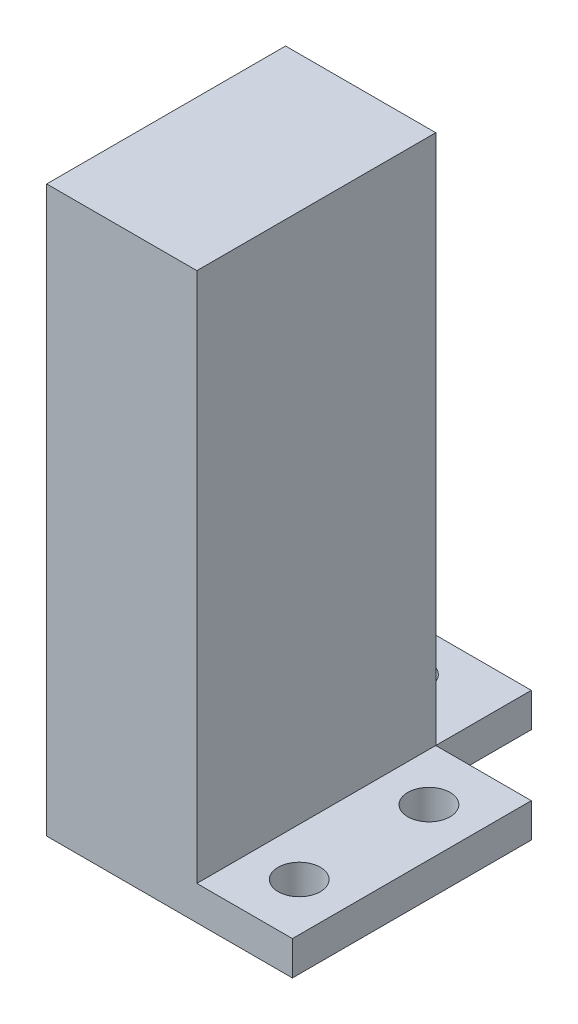
ISO-10303-21;
HEADER;
FILE_DESCRIPTION(('STEP AP214'),'2;1');
FILE_NAME('part.step','',(''),(''),'','','');
FILE_SCHEMA(('AUTOMOTIVE_DESIGN { 1 0 10303 214 1 1 1 1 }'));
ENDSEC;
DATA;
#1=APPLICATION_CONTEXT('core data for automotive mechanical design processes');
#2=APPLICATION_PROTOCOL_DEFINITION('international standard','automotive_design',2000,#1);
#3=PRODUCT_CONTEXT('',#1,'mechanical');
#4=PRODUCT('Part','Part','',(#3));
#5=PRODUCT_RELATED_PRODUCT_CATEGORY('part','',(#4));
#6=PRODUCT_DEFINITION_FORMATION('','',#4);
#7=PRODUCT_DEFINITION_CONTEXT('part definition',#1,'design');
#8=PRODUCT_DEFINITION('design','',#6,#7);
#9=PRODUCT_DEFINITION_SHAPE('','',#8);
#10=(LENGTH_UNIT() NAMED_UNIT(*) SI_UNIT(.MILLI.,.METRE.));
#11=(NAMED_UNIT(*) PLANE_ANGLE_UNIT() SI_UNIT($,.RADIAN.));
#12=(NAMED_UNIT(*) SI_UNIT($,.STERADIAN.) SOLID_ANGLE_UNIT());
#13=UNCERTAINTY_MEASURE_WITH_UNIT(LENGTH_MEASURE(1.E-05),#10,'distance_accuracy_value','');
#14=(GEOMETRIC_REPRESENTATION_CONTEXT(3) GLOBAL_UNCERTAINTY_ASSIGNED_CONTEXT((#13)) GLOBAL_UNIT_ASSIGNED_CONTEXT((#10,
#11,#12)) REPRESENTATION_CONTEXT('',''));
#15=CARTESIAN_POINT('',(0.,0.,0.));
#16=DIRECTION('',(0.,0.,1.));
#17=DIRECTION('',(1.,0.,0.));
#18=AXIS2_PLACEMENT_3D('',#15,#16,#17);
#19=CARTESIAN_POINT('',(11.,49.2196543089587,30.));
#20=DIRECTION('',(-1.,0.,0.));
#21=DIRECTION('',(0.,0.,1.));
#22=AXIS2_PLACEMENT_3D('',#19,#20,#21);
#23=PLANE('',#22);
#24=DIRECTION('',(0.,0.,1.));
#25=VECTOR('',#24,1.);
#26=CARTESIAN_POINT('',(11.,-28.5303456910413,0.));
#27=LINE('',#26,#25);
#28=CARTESIAN_POINT('',(11.,-28.5303456910413,0.));
#29=VERTEX_POINT('',#28);
#30=CARTESIAN_POINT('',(11.,-28.5303456910413,35.));
#31=VERTEX_POINT('',#30);
#32=EDGE_CURVE('E162',#29,#31,#27,.T.);
#33=ORIENTED_EDGE('',*,*,#32,.F.);
#34=DIRECTION('',(0.,1.,0.));
#35=VECTOR('',#34,1.);
#36=CARTESIAN_POINT('',(11.,49.2196543089587,0.));
#37=LINE('',#36,#35);
#38=CARTESIAN_POINT('',(11.,49.2196543089587,0.));
#39=VERTEX_POINT('',#38);
#40=EDGE_CURVE('E232',#29,#39,#37,.T.);
#41=ORIENTED_EDGE('',*,*,#40,.T.);
#42=DIRECTION('',(0.,0.,-1.));
#43=VECTOR('',#42,1.);
#44=CARTESIAN_POINT('',(11.,49.2196543089587,30.));
#45=LINE('',#44,#43);
#46=CARTESIAN_POINT('',(11.,49.2196543089587,35.));
#47=VERTEX_POINT('',#46);
#48=EDGE_CURVE('E235',#47,#39,#45,.T.);
#49=ORIENTED_EDGE('',*,*,#48,.F.);
#50=DIRECTION('',(0.,1.,0.));
#51=VECTOR('',#50,1.);
#52=CARTESIAN_POINT('',(11.,-33.5303456910413,35.));
#53=LINE('',#52,#51);
#54=EDGE_CURVE('E127',#31,#47,#53,.T.);
#55=ORIENTED_EDGE('',*,*,#54,.F.);
#56=EDGE_LOOP('',(#33,#41,#49,#55));
#57=FACE_BOUND('',#56,.T.);
#58=ADVANCED_FACE('F45',(#57),#23,.F.);
#59=CARTESIAN_POINT('',(0.,0.,0.));
#60=DIRECTION('',(0.,0.,1.));
#61=DIRECTION('',(1.,0.,0.));
#62=AXIS2_PLACEMENT_3D('',#59,#60,#61);
#63=PLANE('',#62);
#64=CARTESIAN_POINT('',(0.,7.71965430895869,0.));
#65=DIRECTION('',(0.,0.,1.));
#66=DIRECTION('',(1.,0.,0.));
#67=AXIS2_PLACEMENT_3D('',#64,#65,#66);
#68=CIRCLE('',#67,3.1);
#69=CARTESIAN_POINT('',(3.09999999999998,7.71965430895869,0.));
#70=VERTEX_POINT('',#69);
#71=EDGE_CURVE('E217',#70,#70,#68,.T.);
#72=ORIENTED_EDGE('',*,*,#71,.T.);
#73=EDGE_LOOP('',(#72));
#74=FACE_BOUND('',#73,.T.);
#75=CARTESIAN_POINT('',(0.,35.7196543089587,0.));
#76=DIRECTION('',(0.,0.,1.));
#77=DIRECTION('',(1.,0.,0.));
#78=AXIS2_PLACEMENT_3D('',#75,#76,#77);
#79=CIRCLE('',#78,3.1);
#80=CARTESIAN_POINT('',(3.09999999999998,35.7196543089587,0.));
#81=VERTEX_POINT('',#80);
#82=EDGE_CURVE('E221',#81,#81,#79,.T.);
#83=ORIENTED_EDGE('',*,*,#82,.T.);
#84=EDGE_LOOP('',(#83));
#85=FACE_BOUND('',#84,.T.);
#86=DIRECTION('',(1.,0.,0.));
#87=VECTOR('',#86,1.);
#88=CARTESIAN_POINT('',(0.,-28.5303456910413,0.));
#89=LINE('',#88,#87);
#90=CARTESIAN_POINT('',(-11.,-28.5303456910413,0.));
#91=VERTEX_POINT('',#90);
#92=EDGE_CURVE('E69',#91,#29,#89,.T.);
#93=ORIENTED_EDGE('',*,*,#92,.F.);
#94=DIRECTION('',(0.,-1.,0.));
#95=VECTOR('',#94,1.);
#96=CARTESIAN_POINT('',(-11.,49.2196543089587,0.));
#97=LINE('',#96,#95);
#98=CARTESIAN_POINT('',(-11.,49.2196543089587,0.));
#99=VERTEX_POINT('',#98);
#100=EDGE_CURVE('E229',#99,#91,#97,.T.);
#101=ORIENTED_EDGE('',*,*,#100,.F.);
#102=DIRECTION('',(-1.,0.,0.));
#103=VECTOR('',#102,1.);
#104=CARTESIAN_POINT('',(11.,49.2196543089587,0.));
#105=LINE('',#104,#103);
#106=EDGE_CURVE('E225',#39,#99,#105,.T.);
#107=ORIENTED_EDGE('',*,*,#106,.F.);
#108=ORIENTED_EDGE('',*,*,#40,.F.);
#109=EDGE_LOOP('',(#93,#101,#107,#108));
#110=FACE_BOUND('',#109,.T.);
#111=ADVANCED_FACE('F261',(#74,#85,#110),#63,.F.);
#112=CARTESIAN_POINT('',(11.,49.2196543089587,30.));
#113=DIRECTION('',(0.,-1.,0.));
#114=DIRECTION('',(0.,0.,-1.));
#115=AXIS2_PLACEMENT_3D('',#112,#113,#114);
#116=PLANE('',#115);
#117=ORIENTED_EDGE('',*,*,#106,.T.);
#118=DIRECTION('',(0.,0.,-1.));
#119=VECTOR('',#118,1.);
#120=CARTESIAN_POINT('',(-11.,49.2196543089587,30.));
#121=LINE('',#120,#119);
#122=CARTESIAN_POINT('',(-11.,49.2196543089587,35.));
#123=VERTEX_POINT('',#122);
#124=EDGE_CURVE('E245',#123,#99,#121,.T.);
#125=ORIENTED_EDGE('',*,*,#124,.F.);
#126=DIRECTION('',(-1.,0.,0.));
#127=VECTOR('',#126,1.);
#128=CARTESIAN_POINT('',(11.,49.2196543089587,35.));
#129=LINE('',#128,#127);
#130=EDGE_CURVE('E214',#47,#123,#129,.T.);
#131=ORIENTED_EDGE('',*,*,#130,.F.);
#132=ORIENTED_EDGE('',*,*,#48,.T.);
#133=EDGE_LOOP('',(#117,#125,#131,#132));
#134=FACE_BOUND('',#133,.T.);
#135=ADVANCED_FACE('F47',(#134),#116,.F.);
#136=CARTESIAN_POINT('',(-11.,49.2196543089587,30.));
#137=DIRECTION('',(1.,0.,0.));
#138=DIRECTION('',(0.,0.,-1.));
#139=AXIS2_PLACEMENT_3D('',#136,#137,#138);
#140=PLANE('',#139);
#141=ORIENTED_EDGE('',*,*,#100,.T.);
#142=DIRECTION('',(0.,0.,-1.));
#143=VECTOR('',#142,1.);
#144=CARTESIAN_POINT('',(-11.,-28.5303456910413,0.));
#145=LINE('',#144,#143);
#146=CARTESIAN_POINT('',(-11.,-28.5303456910413,-14.));
#147=VERTEX_POINT('',#146);
#148=EDGE_CURVE('E191',#91,#147,#145,.T.);
#149=ORIENTED_EDGE('',*,*,#148,.T.);
#150=DIRECTION('',(0.,-1.,0.));
#151=VECTOR('',#150,1.);
#152=CARTESIAN_POINT('',(-11.,-28.5303456910413,-14.));
#153=LINE('',#152,#151);
#154=CARTESIAN_POINT('',(-11.,-33.5303456910413,-14.));
#155=VERTEX_POINT('',#154);
#156=EDGE_CURVE('E198',#147,#155,#153,.T.);
#157=ORIENTED_EDGE('',*,*,#156,.T.);
#158=DIRECTION('',(0.,0.,-1.));
#159=VECTOR('',#158,1.);
#160=CARTESIAN_POINT('',(-11.,-33.5303456910413,30.));
#161=LINE('',#160,#159);
#162=CARTESIAN_POINT('',(-11.,-33.5303456910413,35.));
#163=VERTEX_POINT('',#162);
#164=EDGE_CURVE('E242',#163,#155,#161,.T.);
#165=ORIENTED_EDGE('',*,*,#164,.F.);
#166=DIRECTION('',(0.,-1.,0.));
#167=VECTOR('',#166,1.);
#168=CARTESIAN_POINT('',(-11.,49.2196543089587,35.));
#169=LINE('',#168,#167);
#170=EDGE_CURVE('E123',#123,#163,#169,.T.);
#171=ORIENTED_EDGE('',*,*,#170,.F.);
#172=ORIENTED_EDGE('',*,*,#124,.T.);
#173=EDGE_LOOP('',(#141,#149,#157,#165,#171,#172));
#174=FACE_BOUND('',#173,.T.);
#175=ADVANCED_FACE('F285',(#174),#140,.F.);
#176=CARTESIAN_POINT('',(-11.,-33.5303456910413,30.));
#177=DIRECTION('',(0.,1.,0.));
#178=DIRECTION('',(0.,0.,1.));
#179=AXIS2_PLACEMENT_3D('',#176,#177,#178);
#180=PLANE('',#179);
#181=ORIENTED_EDGE('',*,*,#164,.T.);
#182=DIRECTION('',(1.,0.,0.));
#183=VECTOR('',#182,1.);
#184=CARTESIAN_POINT('',(0.,-33.5303456910413,-14.));
#185=LINE('',#184,#183);
#186=CARTESIAN_POINT('',(11.,-33.5303456910413,-14.));
#187=VERTEX_POINT('',#186);
#188=EDGE_CURVE('E147',#155,#187,#185,.T.);
#189=ORIENTED_EDGE('',*,*,#188,.T.);
#190=DIRECTION('',(0.,0.,-1.));
#191=VECTOR('',#190,1.);
#192=CARTESIAN_POINT('',(11.,-33.5303456910413,30.));
#193=LINE('',#192,#191);
#194=CARTESIAN_POINT('',(11.,-33.5303456910413,0.));
#195=VERTEX_POINT('',#194);
#196=EDGE_CURVE('E239',#195,#187,#193,.T.);
#197=ORIENTED_EDGE('',*,*,#196,.F.);
#198=DIRECTION('',(1.,0.,0.));
#199=VECTOR('',#198,1.);
#200=CARTESIAN_POINT('',(0.,-33.5303456910413,0.));
#201=LINE('',#200,#199);
#202=CARTESIAN_POINT('',(25.,-33.5303456910413,0.));
#203=VERTEX_POINT('',#202);
#204=EDGE_CURVE('E61',#195,#203,#201,.T.);
#205=ORIENTED_EDGE('',*,*,#204,.T.);
#206=DIRECTION('',(0.,0.,1.));
#207=VECTOR('',#206,1.);
#208=CARTESIAN_POINT('',(25.,-33.5303456910413,0.));
#209=LINE('',#208,#207);
#210=CARTESIAN_POINT('',(25.,-33.5303456910413,35.));
#211=VERTEX_POINT('',#210);
#212=EDGE_CURVE('E132',#203,#211,#209,.T.);
#213=ORIENTED_EDGE('',*,*,#212,.T.);
#214=DIRECTION('',(1.,0.,0.));
#215=VECTOR('',#214,1.);
#216=CARTESIAN_POINT('',(-11.,-33.5303456910413,35.));
#217=LINE('',#216,#215);
#218=EDGE_CURVE('E116',#163,#211,#217,.T.);
#219=ORIENTED_EDGE('',*,*,#218,.F.);
#220=EDGE_LOOP('',(#181,#189,#197,#205,#213,#219));
#221=FACE_BOUND('',#220,.T.);
#222=CARTESIAN_POINT('',(0.,-33.5303456910413,-7.));
#223=DIRECTION('',(0.,-1.,0.));
#224=DIRECTION('',(0.,0.,-1.));
#225=AXIS2_PLACEMENT_3D('',#222,#223,#224);
#226=CIRCLE('',#225,3.1);
#227=CARTESIAN_POINT('',(0.,-33.5303456910413,-10.1));
#228=VERTEX_POINT('',#227);
#229=EDGE_CURVE('E142',#228,#228,#226,.T.);
#230=ORIENTED_EDGE('',*,*,#229,.F.);
#231=EDGE_LOOP('',(#230));
#232=FACE_BOUND('',#231,.T.);
#233=CARTESIAN_POINT('',(18.,-33.5303456910413,27.));
#234=DIRECTION('',(0.,-1.,0.));
#235=DIRECTION('',(0.,0.,-1.));
#236=AXIS2_PLACEMENT_3D('',#233,#234,#235);
#237=CIRCLE('',#236,3.1);
#238=CARTESIAN_POINT('',(18.,-33.5303456910413,23.9));
#239=VERTEX_POINT('',#238);
#240=EDGE_CURVE('E158',#239,#239,#237,.T.);
#241=ORIENTED_EDGE('',*,*,#240,.F.);
#242=EDGE_LOOP('',(#241));
#243=FACE_BOUND('',#242,.T.);
#244=CARTESIAN_POINT('',(18.,-33.5303456910413,8.));
#245=DIRECTION('',(0.,-1.,0.));
#246=DIRECTION('',(0.,0.,-1.));
#247=AXIS2_PLACEMENT_3D('',#244,#245,#246);
#248=CIRCLE('',#247,3.1);
#249=CARTESIAN_POINT('',(18.,-33.5303456910413,4.9));
#250=VERTEX_POINT('',#249);
#251=EDGE_CURVE('E154',#250,#250,#248,.T.);
#252=ORIENTED_EDGE('',*,*,#251,.F.);
#253=EDGE_LOOP('',(#252));
#254=FACE_BOUND('',#253,.T.);
#255=ADVANCED_FACE('F138',(#221,#232,#243,#254),#180,.F.);
#256=DIRECTION('',(0.,0.,-1.));
#257=VECTOR('',#256,1.);
#258=CARTESIAN_POINT('',(11.,-28.5303456910413,0.));
#259=LINE('',#258,#257);
#260=CARTESIAN_POINT('',(11.,-28.5303456910413,-14.));
#261=VERTEX_POINT('',#260);
#262=EDGE_CURVE('E186',#29,#261,#259,.T.);
#263=ORIENTED_EDGE('',*,*,#262,.F.);
#264=DIRECTION('',(0.,-1.,0.));
#265=VECTOR('',#264,1.);
#266=CARTESIAN_POINT('',(11.,-28.5303456910413,0.));
#267=LINE('',#266,#265);
#268=EDGE_CURVE('E152',#29,#195,#267,.T.);
#269=ORIENTED_EDGE('',*,*,#268,.T.);
#270=ORIENTED_EDGE('',*,*,#196,.T.);
#271=DIRECTION('',(0.,-1.,0.));
#272=VECTOR('',#271,1.);
#273=CARTESIAN_POINT('',(11.,-28.5303456910413,-14.));
#274=LINE('',#273,#272);
#275=EDGE_CURVE('E203',#261,#187,#274,.T.);
#276=ORIENTED_EDGE('',*,*,#275,.F.);
#277=EDGE_LOOP('',(#263,#269,#270,#276));
#278=FACE_BOUND('',#277,.T.);
#279=ADVANCED_FACE('F268',(#278),#23,.F.);
#280=CARTESIAN_POINT('',(0.,35.7196543089587,30.));
#281=DIRECTION('',(0.,0.,-1.));
#282=DIRECTION('',(-1.,0.,0.));
#283=AXIS2_PLACEMENT_3D('',#280,#281,#282);
#284=CYLINDRICAL_SURFACE('',#283,3.1);
#285=CARTESIAN_POINT('',(0.,35.7196543089587,15.));
#286=DIRECTION('',(0.,0.,-1.));
#287=DIRECTION('',(-1.,0.,0.));
#288=AXIS2_PLACEMENT_3D('',#285,#286,#287);
#289=CIRCLE('',#288,3.1);
#290=CARTESIAN_POINT('',(-3.10000000000002,35.7196543089587,15.));
#291=VERTEX_POINT('',#290);
#292=EDGE_CURVE('E11',#291,#291,#289,.T.);
#293=ORIENTED_EDGE('',*,*,#292,.F.);
#294=EDGE_LOOP('',(#293));
#295=FACE_BOUND('',#294,.T.);
#296=ORIENTED_EDGE('',*,*,#82,.F.);
#297=EDGE_LOOP('',(#296));
#298=FACE_BOUND('',#297,.T.);
#299=ADVANCED_FACE('F257',(#295,#298),#284,.F.);
#300=CARTESIAN_POINT('',(0.,7.71965430895869,30.));
#301=DIRECTION('',(0.,0.,-1.));
#302=DIRECTION('',(-1.,0.,0.));
#303=AXIS2_PLACEMENT_3D('',#300,#301,#302);
#304=CYLINDRICAL_SURFACE('',#303,3.1);
#305=CARTESIAN_POINT('',(0.,7.71965430895869,15.));
#306=DIRECTION('',(0.,0.,-1.));
#307=DIRECTION('',(-1.,0.,0.));
#308=AXIS2_PLACEMENT_3D('',#305,#306,#307);
#309=CIRCLE('',#308,3.1);
#310=CARTESIAN_POINT('',(-3.10000000000002,7.71965430895869,15.));
#311=VERTEX_POINT('',#310);
#312=EDGE_CURVE('E54',#311,#311,#309,.T.);
#313=ORIENTED_EDGE('',*,*,#312,.F.);
#314=EDGE_LOOP('',(#313));
#315=FACE_BOUND('',#314,.T.);
#316=ORIENTED_EDGE('',*,*,#71,.F.);
#317=EDGE_LOOP('',(#316));
#318=FACE_BOUND('',#317,.T.);
#319=ADVANCED_FACE('F254',(#315,#318),#304,.F.);
#320=CARTESIAN_POINT('',(0.,0.,35.));
#321=DIRECTION('',(0.,0.,1.));
#322=DIRECTION('',(1.,0.,0.));
#323=AXIS2_PLACEMENT_3D('',#320,#321,#322);
#324=PLANE('',#323);
#325=ORIENTED_EDGE('',*,*,#170,.T.);
#326=ORIENTED_EDGE('',*,*,#218,.T.);
#327=DIRECTION('',(0.,-1.,0.));
#328=VECTOR('',#327,1.);
#329=CARTESIAN_POINT('',(25.,-28.5303456910413,35.));
#330=LINE('',#329,#328);
#331=CARTESIAN_POINT('',(25.,-28.5303456910413,35.));
#332=VERTEX_POINT('',#331);
#333=EDGE_CURVE('E119',#332,#211,#330,.T.);
#334=ORIENTED_EDGE('',*,*,#333,.F.);
#335=DIRECTION('',(1.,0.,0.));
#336=VECTOR('',#335,1.);
#337=CARTESIAN_POINT('',(0.,-28.5303456910413,35.));
#338=LINE('',#337,#336);
#339=EDGE_CURVE('E149',#31,#332,#338,.T.);
#340=ORIENTED_EDGE('',*,*,#339,.F.);
#341=ORIENTED_EDGE('',*,*,#54,.T.);
#342=ORIENTED_EDGE('',*,*,#130,.T.);
#343=EDGE_LOOP('',(#325,#326,#334,#340,#341,#342));
#344=FACE_BOUND('',#343,.T.);
#345=ADVANCED_FACE('F118',(#344),#324,.T.);
#346=CARTESIAN_POINT('',(0.,-28.5303456910413,-14.));
#347=DIRECTION('',(0.,0.,-1.));
#348=DIRECTION('',(-1.,0.,0.));
#349=AXIS2_PLACEMENT_3D('',#346,#347,#348);
#350=PLANE('',#349);
#351=ORIENTED_EDGE('',*,*,#188,.F.);
#352=ORIENTED_EDGE('',*,*,#156,.F.);
#353=DIRECTION('',(1.,0.,0.));
#354=VECTOR('',#353,1.);
#355=CARTESIAN_POINT('',(0.,-28.5303456910413,-14.));
#356=LINE('',#355,#354);
#357=EDGE_CURVE('E195',#147,#261,#356,.T.);
#358=ORIENTED_EDGE('',*,*,#357,.T.);
#359=ORIENTED_EDGE('',*,*,#275,.T.);
#360=EDGE_LOOP('',(#351,#352,#358,#359));
#361=FACE_BOUND('',#360,.T.);
#362=ADVANCED_FACE('F301',(#361),#350,.T.);
#363=CARTESIAN_POINT('',(0.,-28.5303456910413,-7.));
#364=DIRECTION('',(0.,-1.,0.));
#365=DIRECTION('',(0.,0.,-1.));
#366=AXIS2_PLACEMENT_3D('',#363,#364,#365);
#367=CYLINDRICAL_SURFACE('',#366,3.1);
#368=CARTESIAN_POINT('',(0.,-28.5303456910413,-7.));
#369=DIRECTION('',(0.,-1.,0.));
#370=DIRECTION('',(0.,0.,-1.));
#371=AXIS2_PLACEMENT_3D('',#368,#369,#370);
#372=CIRCLE('',#371,3.1);
#373=CARTESIAN_POINT('',(0.,-28.5303456910413,-10.1));
#374=VERTEX_POINT('',#373);
#375=EDGE_CURVE('E182',#374,#374,#372,.T.);
#376=ORIENTED_EDGE('',*,*,#375,.F.);
#377=EDGE_LOOP('',(#376));
#378=FACE_BOUND('',#377,.T.);
#379=ORIENTED_EDGE('',*,*,#229,.T.);
#380=EDGE_LOOP('',(#379));
#381=FACE_BOUND('',#380,.T.);
#382=ADVANCED_FACE('F327',(#378,#381),#367,.F.);
#383=CARTESIAN_POINT('',(0.,-28.5303456910413,0.));
#384=DIRECTION('',(0.,-1.,0.));
#385=DIRECTION('',(0.,0.,-1.));
#386=AXIS2_PLACEMENT_3D('',#383,#384,#385);
#387=PLANE('',#386);
#388=ORIENTED_EDGE('',*,*,#375,.T.);
#389=EDGE_LOOP('',(#388));
#390=FACE_BOUND('',#389,.T.);
#391=ORIENTED_EDGE('',*,*,#262,.T.);
#392=ORIENTED_EDGE('',*,*,#357,.F.);
#393=ORIENTED_EDGE('',*,*,#148,.F.);
#394=ORIENTED_EDGE('',*,*,#92,.T.);
#395=EDGE_LOOP('',(#391,#392,#393,#394));
#396=FACE_BOUND('',#395,.T.);
#397=ADVANCED_FACE('F296',(#390,#396),#387,.F.);
#398=CARTESIAN_POINT('',(0.,-28.5303456910413,0.));
#399=DIRECTION('',(0.,0.,-1.));
#400=DIRECTION('',(-1.,0.,0.));
#401=AXIS2_PLACEMENT_3D('',#398,#399,#400);
#402=PLANE('',#401);
#403=ORIENTED_EDGE('',*,*,#204,.F.);
#404=ORIENTED_EDGE('',*,*,#268,.F.);
#405=DIRECTION('',(1.,0.,0.));
#406=VECTOR('',#405,1.);
#407=CARTESIAN_POINT('',(0.,-28.5303456910413,0.));
#408=LINE('',#407,#406);
#409=CARTESIAN_POINT('',(25.,-28.5303456910413,0.));
#410=VERTEX_POINT('',#409);
#411=EDGE_CURVE('E171',#29,#410,#408,.T.);
#412=ORIENTED_EDGE('',*,*,#411,.T.);
#413=DIRECTION('',(0.,-1.,0.));
#414=VECTOR('',#413,1.);
#415=CARTESIAN_POINT('',(25.,-28.5303456910413,0.));
#416=LINE('',#415,#414);
#417=EDGE_CURVE('E175',#410,#203,#416,.T.);
#418=ORIENTED_EDGE('',*,*,#417,.T.);
#419=EDGE_LOOP('',(#403,#404,#412,#418));
#420=FACE_BOUND('',#419,.T.);
#421=ADVANCED_FACE('F306',(#420),#402,.T.);
#422=CARTESIAN_POINT('',(18.,-28.5303456910413,8.));
#423=DIRECTION('',(0.,-1.,0.));
#424=DIRECTION('',(0.,0.,-1.));
#425=AXIS2_PLACEMENT_3D('',#422,#423,#424);
#426=CYLINDRICAL_SURFACE('',#425,3.1);
#427=CARTESIAN_POINT('',(18.,-28.5303456910413,8.));
#428=DIRECTION('',(0.,-1.,0.));
#429=DIRECTION('',(0.,0.,-1.));
#430=AXIS2_PLACEMENT_3D('',#427,#428,#429);
#431=CIRCLE('',#430,3.1);
#432=CARTESIAN_POINT('',(18.,-28.5303456910413,4.9));
#433=VERTEX_POINT('',#432);
#434=EDGE_CURVE('E166',#433,#433,#431,.T.);
#435=ORIENTED_EDGE('',*,*,#434,.F.);
#436=EDGE_LOOP('',(#435));
#437=FACE_BOUND('',#436,.T.);
#438=ORIENTED_EDGE('',*,*,#251,.T.);
#439=EDGE_LOOP('',(#438));
#440=FACE_BOUND('',#439,.T.);
#441=ADVANCED_FACE('F359',(#437,#440),#426,.F.);
#442=CARTESIAN_POINT('',(18.,-28.5303456910413,27.));
#443=DIRECTION('',(0.,-1.,0.));
#444=DIRECTION('',(0.,0.,-1.));
#445=AXIS2_PLACEMENT_3D('',#442,#443,#444);
#446=CYLINDRICAL_SURFACE('',#445,3.1);
#447=CARTESIAN_POINT('',(18.,-28.5303456910413,27.));
#448=DIRECTION('',(0.,-1.,0.));
#449=DIRECTION('',(0.,0.,-1.));
#450=AXIS2_PLACEMENT_3D('',#447,#448,#449);
#451=CIRCLE('',#450,3.1);
#452=CARTESIAN_POINT('',(18.,-28.5303456910413,23.9));
#453=VERTEX_POINT('',#452);
#454=EDGE_CURVE('E136',#453,#453,#451,.T.);
#455=ORIENTED_EDGE('',*,*,#454,.F.);
#456=EDGE_LOOP('',(#455));
#457=FACE_BOUND('',#456,.T.);
#458=ORIENTED_EDGE('',*,*,#240,.T.);
#459=EDGE_LOOP('',(#458));
#460=FACE_BOUND('',#459,.T.);
#461=ADVANCED_FACE('F320',(#457,#460),#446,.F.);
#462=CARTESIAN_POINT('',(25.,-28.5303456910413,0.));
#463=DIRECTION('',(1.,0.,0.));
#464=DIRECTION('',(0.,0.,-1.));
#465=AXIS2_PLACEMENT_3D('',#462,#463,#464);
#466=PLANE('',#465);
#467=ORIENTED_EDGE('',*,*,#212,.F.);
#468=ORIENTED_EDGE('',*,*,#417,.F.);
#469=DIRECTION('',(0.,0.,1.));
#470=VECTOR('',#469,1.);
#471=CARTESIAN_POINT('',(25.,-28.5303456910413,0.));
#472=LINE('',#471,#470);
#473=EDGE_CURVE('E134',#410,#332,#472,.T.);
#474=ORIENTED_EDGE('',*,*,#473,.T.);
#475=ORIENTED_EDGE('',*,*,#333,.T.);
#476=EDGE_LOOP('',(#467,#468,#474,#475));
#477=FACE_BOUND('',#476,.T.);
#478=ADVANCED_FACE('F131',(#477),#466,.T.);
#479=CARTESIAN_POINT('',(0.,-28.5303456910413,0.));
#480=DIRECTION('',(0.,-1.,0.));
#481=DIRECTION('',(0.,0.,-1.));
#482=AXIS2_PLACEMENT_3D('',#479,#480,#481);
#483=PLANE('',#482);
#484=ORIENTED_EDGE('',*,*,#454,.T.);
#485=EDGE_LOOP('',(#484));
#486=FACE_BOUND('',#485,.T.);
#487=ORIENTED_EDGE('',*,*,#434,.T.);
#488=EDGE_LOOP('',(#487));
#489=FACE_BOUND('',#488,.T.);
#490=ORIENTED_EDGE('',*,*,#411,.F.);
#491=ORIENTED_EDGE('',*,*,#32,.T.);
#492=ORIENTED_EDGE('',*,*,#339,.T.);
#493=ORIENTED_EDGE('',*,*,#473,.F.);
#494=EDGE_LOOP('',(#490,#491,#492,#493));
#495=FACE_BOUND('',#494,.T.);
#496=ADVANCED_FACE('F308',(#486,#489,#495),#483,.F.);
#497=CARTESIAN_POINT('',(0.,7.71965430895869,15.));
#498=DIRECTION('',(0.,0.,-1.));
#499=DIRECTION('',(-1.,0.,0.));
#500=AXIS2_PLACEMENT_3D('',#497,#498,#499);
#501=PLANE('',#500);
#502=ORIENTED_EDGE('',*,*,#312,.T.);
#503=EDGE_LOOP('',(#502));
#504=FACE_BOUND('',#503,.T.);
#505=ADVANCED_FACE('F252',(#504),#501,.T.);
#506=CARTESIAN_POINT('',(0.,35.7196543089587,15.));
#507=DIRECTION('',(0.,0.,-1.));
#508=DIRECTION('',(-1.,0.,0.));
#509=AXIS2_PLACEMENT_3D('',#506,#507,#508);
#510=PLANE('',#509);
#511=ORIENTED_EDGE('',*,*,#292,.T.);
#512=EDGE_LOOP('',(#511));
#513=FACE_BOUND('',#512,.T.);
#514=ADVANCED_FACE('F318',(#513),#510,.T.);
#515=CLOSED_SHELL('',(#58,#111,#135,#175,#255,#279,#299,#319,#345,#362,#382,#397,#421,#441,#461,
#478,#496,#505,#514));
#516=MANIFOLD_SOLID_BREP('B2',#515);
#517=ADVANCED_BREP_SHAPE_REPRESENTATION('',(#18,#516),#14);
#518=SHAPE_DEFINITION_REPRESENTATION(#9,#517);
ENDSEC;
END-ISO-10303-21;
